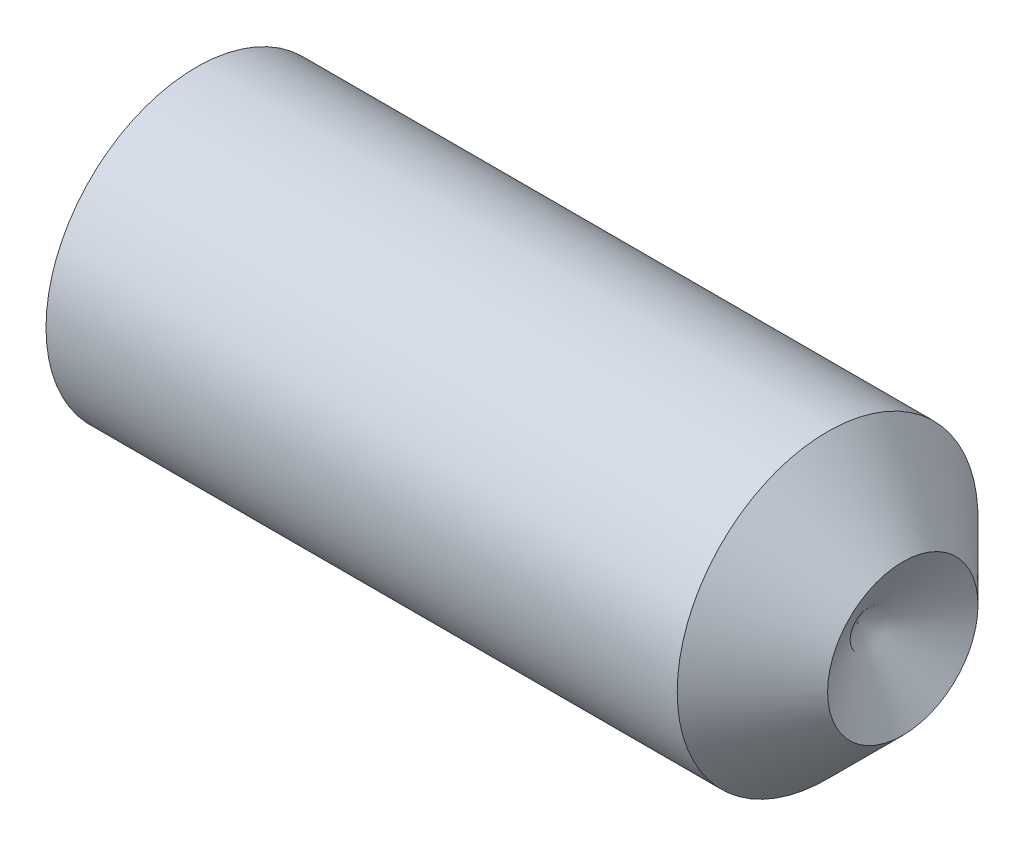
ISO-10303-21;
HEADER;
FILE_DESCRIPTION(('STEP AP214'),'2;1');
FILE_NAME('part.step','',(''),(''),'','','');
FILE_SCHEMA(('AUTOMOTIVE_DESIGN { 1 0 10303 214 1 1 1 1 }'));
ENDSEC;
DATA;
#1=APPLICATION_CONTEXT('core data for automotive mechanical design processes');
#2=APPLICATION_PROTOCOL_DEFINITION('international standard','automotive_design',2000,#1);
#3=PRODUCT_CONTEXT('',#1,'mechanical');
#4=PRODUCT('Part','Part','',(#3));
#5=PRODUCT_RELATED_PRODUCT_CATEGORY('part','',(#4));
#6=PRODUCT_DEFINITION_FORMATION('','',#4);
#7=PRODUCT_DEFINITION_CONTEXT('part definition',#1,'design');
#8=PRODUCT_DEFINITION('design','',#6,#7);
#9=PRODUCT_DEFINITION_SHAPE('','',#8);
#10=(LENGTH_UNIT() NAMED_UNIT(*) SI_UNIT(.MILLI.,.METRE.));
#11=(NAMED_UNIT(*) PLANE_ANGLE_UNIT() SI_UNIT($,.RADIAN.));
#12=(NAMED_UNIT(*) SI_UNIT($,.STERADIAN.) SOLID_ANGLE_UNIT());
#13=UNCERTAINTY_MEASURE_WITH_UNIT(LENGTH_MEASURE(1.E-05),#10,'distance_accuracy_value','');
#14=(GEOMETRIC_REPRESENTATION_CONTEXT(3) GLOBAL_UNCERTAINTY_ASSIGNED_CONTEXT((#13)) GLOBAL_UNIT_ASSIGNED_CONTEXT((#10,
#11,#12)) REPRESENTATION_CONTEXT('',''));
#15=CARTESIAN_POINT('',(0.,0.,0.));
#16=DIRECTION('',(0.,0.,1.));
#17=DIRECTION('',(1.,0.,0.));
#18=AXIS2_PLACEMENT_3D('',#15,#16,#17);
#19=CARTESIAN_POINT('',(0.,0.,0.));
#20=DIRECTION('',(-1.,0.,0.));
#21=DIRECTION('',(0.,0.,1.));
#22=AXIS2_PLACEMENT_3D('',#19,#20,#21);
#23=PLANE('',#22);
#24=CARTESIAN_POINT('',(0.,0.,0.));
#25=DIRECTION('',(-1.,0.,0.));
#26=DIRECTION('',(0.,0.,1.));
#27=AXIS2_PLACEMENT_3D('',#24,#25,#26);
#28=CIRCLE('',#27,2.055);
#29=CARTESIAN_POINT('',(0.,0.,2.055));
#30=VERTEX_POINT('',#29);
#31=EDGE_CURVE('E11',#30,#30,#28,.T.);
#32=ORIENTED_EDGE('',*,*,#31,.T.);
#33=EDGE_LOOP('',(#32));
#34=FACE_BOUND('',#33,.T.);
#35=DIRECTION('',(0.,0.,-1.));
#36=VECTOR('',#35,1.);
#37=CARTESIAN_POINT('',(0.,1.25,0.721687836487029));
#38=LINE('',#37,#36);
#39=CARTESIAN_POINT('',(0.,1.25,0.721687836487029));
#40=VERTEX_POINT('',#39);
#41=CARTESIAN_POINT('',(0.,1.25,-0.721687836487035));
#42=VERTEX_POINT('',#41);
#43=EDGE_CURVE('E95',#40,#42,#38,.T.);
#44=ORIENTED_EDGE('',*,*,#43,.F.);
#45=DIRECTION('',(0.,-0.866025403784439,0.5));
#46=VECTOR('',#45,1.);
#47=CARTESIAN_POINT('',(0.,1.25,0.721687836487029));
#48=LINE('',#47,#46);
#49=CARTESIAN_POINT('',(0.,0.,1.44337567297406));
#50=VERTEX_POINT('',#49);
#51=EDGE_CURVE('E48',#40,#50,#48,.T.);
#52=ORIENTED_EDGE('',*,*,#51,.T.);
#53=DIRECTION('',(0.,0.866025403784439,0.5));
#54=VECTOR('',#53,1.);
#55=CARTESIAN_POINT('',(0.,-1.25,0.721687836487029));
#56=LINE('',#55,#54);
#57=CARTESIAN_POINT('',(0.,-1.25,0.721687836487029));
#58=VERTEX_POINT('',#57);
#59=EDGE_CURVE('E101',#58,#50,#56,.T.);
#60=ORIENTED_EDGE('',*,*,#59,.F.);
#61=DIRECTION('',(0.,0.,-1.));
#62=VECTOR('',#61,1.);
#63=CARTESIAN_POINT('',(0.,-1.25,0.721687836487029));
#64=LINE('',#63,#62);
#65=CARTESIAN_POINT('',(0.,-1.25,-0.721687836487035));
#66=VERTEX_POINT('',#65);
#67=EDGE_CURVE('E121',#58,#66,#64,.T.);
#68=ORIENTED_EDGE('',*,*,#67,.T.);
#69=DIRECTION('',(0.,0.866025403784439,-0.5));
#70=VECTOR('',#69,1.);
#71=CARTESIAN_POINT('',(0.,-1.25,-0.721687836487035));
#72=LINE('',#71,#70);
#73=CARTESIAN_POINT('',(0.,0.,-1.44337567297407));
#74=VERTEX_POINT('',#73);
#75=EDGE_CURVE('E124',#66,#74,#72,.T.);
#76=ORIENTED_EDGE('',*,*,#75,.T.);
#77=DIRECTION('',(0.,-0.866025403784439,-0.5));
#78=VECTOR('',#77,1.);
#79=CARTESIAN_POINT('',(0.,1.25,-0.721687836487035));
#80=LINE('',#79,#78);
#81=EDGE_CURVE('E127',#42,#74,#80,.T.);
#82=ORIENTED_EDGE('',*,*,#81,.F.);
#83=EDGE_LOOP('',(#44,#52,#60,#68,#76,#82));
#84=FACE_BOUND('',#83,.T.);
#85=ADVANCED_FACE('F34',(#34,#84),#23,.T.);
#86=CARTESIAN_POINT('',(0.,0.,0.));
#87=DIRECTION('',(1.,0.,0.));
#88=DIRECTION('',(0.,0.,-1.));
#89=AXIS2_PLACEMENT_3D('',#86,#87,#88);
#90=CONICAL_SURFACE('',#89,2.055,1.0471975511966);
#91=CARTESIAN_POINT('',(0.256920869789382,0.,0.));
#92=DIRECTION('',(-1.,0.,0.));
#93=DIRECTION('',(0.,0.,1.));
#94=AXIS2_PLACEMENT_3D('',#91,#92,#93);
#95=CIRCLE('',#94,2.5);
#96=CARTESIAN_POINT('',(0.256920869789382,0.,2.5));
#97=VERTEX_POINT('',#96);
#98=EDGE_CURVE('E41',#97,#97,#95,.T.);
#99=ORIENTED_EDGE('',*,*,#98,.T.);
#100=EDGE_LOOP('',(#99));
#101=FACE_BOUND('',#100,.T.);
#102=ORIENTED_EDGE('',*,*,#31,.F.);
#103=EDGE_LOOP('',(#102));
#104=FACE_BOUND('',#103,.T.);
#105=ADVANCED_FACE('F147',(#101,#104),#90,.T.);
#106=CARTESIAN_POINT('',(-12.7,0.,0.));
#107=DIRECTION('',(-1.,0.,0.));
#108=DIRECTION('',(0.,0.,1.));
#109=AXIS2_PLACEMENT_3D('',#106,#107,#108);
#110=CYLINDRICAL_SURFACE('',#109,2.5);
#111=CARTESIAN_POINT('',(10.75,0.,0.));
#112=DIRECTION('',(-1.,0.,0.));
#113=DIRECTION('',(0.,0.,1.));
#114=AXIS2_PLACEMENT_3D('',#111,#112,#113);
#115=CIRCLE('',#114,2.5);
#116=CARTESIAN_POINT('',(10.75,0.,2.5));
#117=VERTEX_POINT('',#116);
#118=EDGE_CURVE('E142',#117,#117,#115,.T.);
#119=ORIENTED_EDGE('',*,*,#118,.T.);
#120=EDGE_LOOP('',(#119));
#121=FACE_BOUND('',#120,.T.);
#122=ORIENTED_EDGE('',*,*,#98,.F.);
#123=EDGE_LOOP('',(#122));
#124=FACE_BOUND('',#123,.T.);
#125=ADVANCED_FACE('F150',(#121,#124),#110,.T.);
#126=CARTESIAN_POINT('',(10.75,0.,0.));
#127=DIRECTION('',(-1.,0.,0.));
#128=DIRECTION('',(0.,0.,1.));
#129=AXIS2_PLACEMENT_3D('',#126,#127,#128);
#130=CONICAL_SURFACE('',#129,2.5,0.785398163397453);
#131=CARTESIAN_POINT('',(12.,0.,0.));
#132=DIRECTION('',(-1.,0.,0.));
#133=DIRECTION('',(0.,0.,1.));
#134=AXIS2_PLACEMENT_3D('',#131,#132,#133);
#135=CIRCLE('',#134,1.25);
#136=CARTESIAN_POINT('',(12.,0.,1.25));
#137=VERTEX_POINT('',#136);
#138=EDGE_CURVE('E102',#137,#137,#135,.T.);
#139=ORIENTED_EDGE('',*,*,#138,.T.);
#140=EDGE_LOOP('',(#139));
#141=FACE_BOUND('',#140,.T.);
#142=ORIENTED_EDGE('',*,*,#118,.F.);
#143=EDGE_LOOP('',(#142));
#144=FACE_BOUND('',#143,.T.);
#145=ADVANCED_FACE('F152',(#141,#144),#130,.T.);
#146=CARTESIAN_POINT('',(11.2489242262156,0.,0.));
#147=DIRECTION('',(1.,0.,0.));
#148=DIRECTION('',(0.,0.,-1.));
#149=AXIS2_PLACEMENT_3D('',#146,#147,#148);
#150=CONICAL_SURFACE('',#149,0.,1.02974425867666);
#151=ORIENTED_EDGE('',*,*,#138,.F.);
#152=EDGE_LOOP('',(#151));
#153=FACE_BOUND('',#152,.T.);
#154=CARTESIAN_POINT('',(11.2489242262156,0.,0.));
#155=VERTEX_POINT('',#154);
#156=VERTEX_LOOP('',#155);
#157=FACE_BOUND('',#156,.T.);
#158=ADVANCED_FACE('F159',(#153,#157),#150,.F.);
#159=CARTESIAN_POINT('',(2.7,1.25,0.721687836487029));
#160=DIRECTION('',(0.,-0.5,-0.866025403784439));
#161=DIRECTION('',(0.,0.866025403784439,-0.5));
#162=AXIS2_PLACEMENT_3D('',#159,#160,#161);
#163=PLANE('',#162);
#164=ORIENTED_EDGE('',*,*,#51,.F.);
#165=DIRECTION('',(-1.,0.,0.));
#166=VECTOR('',#165,1.);
#167=CARTESIAN_POINT('',(2.7,1.25,0.721687836487029));
#168=LINE('',#167,#166);
#169=CARTESIAN_POINT('',(2.7,1.25,0.721687836487029));
#170=VERTEX_POINT('',#169);
#171=EDGE_CURVE('E89',#170,#40,#168,.T.);
#172=ORIENTED_EDGE('',*,*,#171,.F.);
#173=DIRECTION('',(0.,-0.866025403784439,0.5));
#174=VECTOR('',#173,1.);
#175=CARTESIAN_POINT('',(2.7,1.25,0.721687836487029));
#176=LINE('',#175,#174);
#177=CARTESIAN_POINT('',(2.7,0.,1.44337567297406));
#178=VERTEX_POINT('',#177);
#179=EDGE_CURVE('E84',#170,#178,#176,.T.);
#180=ORIENTED_EDGE('',*,*,#179,.T.);
#181=DIRECTION('',(-1.,0.,0.));
#182=VECTOR('',#181,1.);
#183=CARTESIAN_POINT('',(2.7,0.,1.44337567297406));
#184=LINE('',#183,#182);
#185=EDGE_CURVE('E87',#178,#50,#184,.T.);
#186=ORIENTED_EDGE('',*,*,#185,.T.);
#187=EDGE_LOOP('',(#164,#172,#180,#186));
#188=FACE_BOUND('',#187,.T.);
#189=ADVANCED_FACE('F86',(#188),#163,.T.);
#190=CARTESIAN_POINT('',(2.7,-1.25,0.721687836487029));
#191=DIRECTION('',(0.,-0.5,0.866025403784439));
#192=DIRECTION('',(0.,-0.866025403784439,-0.5));
#193=AXIS2_PLACEMENT_3D('',#190,#191,#192);
#194=PLANE('',#193);
#195=ORIENTED_EDGE('',*,*,#59,.T.);
#196=ORIENTED_EDGE('',*,*,#185,.F.);
#197=DIRECTION('',(0.,0.866025403784439,0.5));
#198=VECTOR('',#197,1.);
#199=CARTESIAN_POINT('',(2.7,-1.25,0.721687836487029));
#200=LINE('',#199,#198);
#201=CARTESIAN_POINT('',(2.7,-1.25,0.721687836487029));
#202=VERTEX_POINT('',#201);
#203=EDGE_CURVE('E94',#202,#178,#200,.T.);
#204=ORIENTED_EDGE('',*,*,#203,.F.);
#205=DIRECTION('',(-1.,0.,0.));
#206=VECTOR('',#205,1.);
#207=CARTESIAN_POINT('',(2.7,-1.25,0.721687836487029));
#208=LINE('',#207,#206);
#209=EDGE_CURVE('E103',#202,#58,#208,.T.);
#210=ORIENTED_EDGE('',*,*,#209,.T.);
#211=EDGE_LOOP('',(#195,#196,#204,#210));
#212=FACE_BOUND('',#211,.T.);
#213=ADVANCED_FACE('F99',(#212),#194,.F.);
#214=CARTESIAN_POINT('',(2.7,-1.25,0.721687836487029));
#215=DIRECTION('',(0.,1.,0.));
#216=DIRECTION('',(0.,0.,1.));
#217=AXIS2_PLACEMENT_3D('',#214,#215,#216);
#218=PLANE('',#217);
#219=ORIENTED_EDGE('',*,*,#67,.F.);
#220=ORIENTED_EDGE('',*,*,#209,.F.);
#221=DIRECTION('',(0.,0.,-1.));
#222=VECTOR('',#221,1.);
#223=CARTESIAN_POINT('',(2.7,-1.25,0.721687836487029));
#224=LINE('',#223,#222);
#225=CARTESIAN_POINT('',(2.7,-1.25,-0.721687836487035));
#226=VERTEX_POINT('',#225);
#227=EDGE_CURVE('E108',#202,#226,#224,.T.);
#228=ORIENTED_EDGE('',*,*,#227,.T.);
#229=DIRECTION('',(-1.,0.,0.));
#230=VECTOR('',#229,1.);
#231=CARTESIAN_POINT('',(2.7,-1.25,-0.721687836487035));
#232=LINE('',#231,#230);
#233=EDGE_CURVE('E137',#226,#66,#232,.T.);
#234=ORIENTED_EDGE('',*,*,#233,.T.);
#235=EDGE_LOOP('',(#219,#220,#228,#234));
#236=FACE_BOUND('',#235,.T.);
#237=ADVANCED_FACE('F182',(#236),#218,.T.);
#238=CARTESIAN_POINT('',(2.7,-1.25,-0.721687836487035));
#239=DIRECTION('',(0.,0.5,0.866025403784439));
#240=DIRECTION('',(0.,-0.866025403784439,0.5));
#241=AXIS2_PLACEMENT_3D('',#238,#239,#240);
#242=PLANE('',#241);
#243=ORIENTED_EDGE('',*,*,#75,.F.);
#244=ORIENTED_EDGE('',*,*,#233,.F.);
#245=DIRECTION('',(0.,0.866025403784439,-0.5));
#246=VECTOR('',#245,1.);
#247=CARTESIAN_POINT('',(2.7,-1.25,-0.721687836487035));
#248=LINE('',#247,#246);
#249=CARTESIAN_POINT('',(2.7,0.,-1.44337567297407));
#250=VERTEX_POINT('',#249);
#251=EDGE_CURVE('E110',#226,#250,#248,.T.);
#252=ORIENTED_EDGE('',*,*,#251,.T.);
#253=DIRECTION('',(-1.,0.,0.));
#254=VECTOR('',#253,1.);
#255=CARTESIAN_POINT('',(2.7,0.,-1.44337567297407));
#256=LINE('',#255,#254);
#257=EDGE_CURVE('E135',#250,#74,#256,.T.);
#258=ORIENTED_EDGE('',*,*,#257,.T.);
#259=EDGE_LOOP('',(#243,#244,#252,#258));
#260=FACE_BOUND('',#259,.T.);
#261=ADVANCED_FACE('F178',(#260),#242,.T.);
#262=CARTESIAN_POINT('',(2.7,1.25,-0.721687836487035));
#263=DIRECTION('',(0.,0.5,-0.866025403784438));
#264=DIRECTION('',(0.,0.866025403784439,0.5));
#265=AXIS2_PLACEMENT_3D('',#262,#263,#264);
#266=PLANE('',#265);
#267=ORIENTED_EDGE('',*,*,#81,.T.);
#268=ORIENTED_EDGE('',*,*,#257,.F.);
#269=DIRECTION('',(0.,-0.866025403784439,-0.5));
#270=VECTOR('',#269,1.);
#271=CARTESIAN_POINT('',(2.7,1.25,-0.721687836487035));
#272=LINE('',#271,#270);
#273=CARTESIAN_POINT('',(2.7,1.25,-0.721687836487035));
#274=VERTEX_POINT('',#273);
#275=EDGE_CURVE('E114',#274,#250,#272,.T.);
#276=ORIENTED_EDGE('',*,*,#275,.F.);
#277=DIRECTION('',(-1.,0.,0.));
#278=VECTOR('',#277,1.);
#279=CARTESIAN_POINT('',(2.7,1.25,-0.721687836487035));
#280=LINE('',#279,#278);
#281=EDGE_CURVE('E133',#274,#42,#280,.T.);
#282=ORIENTED_EDGE('',*,*,#281,.T.);
#283=EDGE_LOOP('',(#267,#268,#276,#282));
#284=FACE_BOUND('',#283,.T.);
#285=ADVANCED_FACE('F175',(#284),#266,.F.);
#286=CARTESIAN_POINT('',(2.7,1.25,0.721687836487029));
#287=DIRECTION('',(0.,1.,0.));
#288=DIRECTION('',(0.,0.,1.));
#289=AXIS2_PLACEMENT_3D('',#286,#287,#288);
#290=PLANE('',#289);
#291=ORIENTED_EDGE('',*,*,#43,.T.);
#292=ORIENTED_EDGE('',*,*,#281,.F.);
#293=DIRECTION('',(0.,0.,-1.));
#294=VECTOR('',#293,1.);
#295=CARTESIAN_POINT('',(2.7,1.25,0.721687836487029));
#296=LINE('',#295,#294);
#297=EDGE_CURVE('E117',#170,#274,#296,.T.);
#298=ORIENTED_EDGE('',*,*,#297,.F.);
#299=ORIENTED_EDGE('',*,*,#171,.T.);
#300=EDGE_LOOP('',(#291,#292,#298,#299));
#301=FACE_BOUND('',#300,.T.);
#302=ADVANCED_FACE('F171',(#301),#290,.F.);
#303=CARTESIAN_POINT('',(2.7,1.25,0.721687836487029));
#304=DIRECTION('',(1.,0.,0.));
#305=DIRECTION('',(0.,0.,-1.));
#306=AXIS2_PLACEMENT_3D('',#303,#304,#305);
#307=PLANE('',#306);
#308=ORIENTED_EDGE('',*,*,#179,.F.);
#309=ORIENTED_EDGE('',*,*,#297,.T.);
#310=ORIENTED_EDGE('',*,*,#275,.T.);
#311=ORIENTED_EDGE('',*,*,#251,.F.);
#312=ORIENTED_EDGE('',*,*,#227,.F.);
#313=ORIENTED_EDGE('',*,*,#203,.T.);
#314=EDGE_LOOP('',(#308,#309,#310,#311,#312,#313));
#315=FACE_BOUND('',#314,.T.);
#316=ADVANCED_FACE('F106',(#315),#307,.F.);
#317=CLOSED_SHELL('',(#85,#105,#125,#145,#158,#189,#213,#237,#261,#285,#302,#316));
#318=MANIFOLD_SOLID_BREP('B2',#317);
#319=ADVANCED_BREP_SHAPE_REPRESENTATION('',(#18,#318),#14);
#320=SHAPE_DEFINITION_REPRESENTATION(#9,#319);
ENDSEC;
END-ISO-10303-21;
